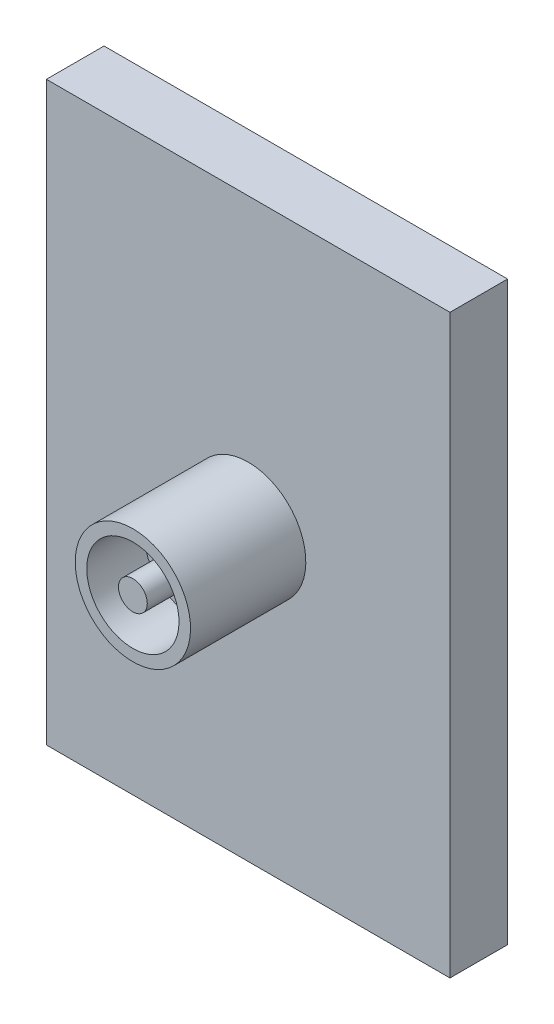
ISO-10303-21;
HEADER;
FILE_DESCRIPTION(('STEP AP214'),'2;1');
FILE_NAME('part.step','',(''),(''),'','','');
FILE_SCHEMA(('AUTOMOTIVE_DESIGN { 1 0 10303 214 1 1 1 1 }'));
ENDSEC;
DATA;
#1=APPLICATION_CONTEXT('core data for automotive mechanical design processes');
#2=APPLICATION_PROTOCOL_DEFINITION('international standard','automotive_design',2000,#1);
#3=PRODUCT_CONTEXT('',#1,'mechanical');
#4=PRODUCT('Part','Part','',(#3));
#5=PRODUCT_RELATED_PRODUCT_CATEGORY('part','',(#4));
#6=PRODUCT_DEFINITION_FORMATION('','',#4);
#7=PRODUCT_DEFINITION_CONTEXT('part definition',#1,'design');
#8=PRODUCT_DEFINITION('design','',#6,#7);
#9=PRODUCT_DEFINITION_SHAPE('','',#8);
#10=(LENGTH_UNIT() NAMED_UNIT(*) SI_UNIT(.MILLI.,.METRE.));
#11=(NAMED_UNIT(*) PLANE_ANGLE_UNIT() SI_UNIT($,.RADIAN.));
#12=(NAMED_UNIT(*) SI_UNIT($,.STERADIAN.) SOLID_ANGLE_UNIT());
#13=UNCERTAINTY_MEASURE_WITH_UNIT(LENGTH_MEASURE(1.E-05),#10,'distance_accuracy_value','');
#14=(GEOMETRIC_REPRESENTATION_CONTEXT(3) GLOBAL_UNCERTAINTY_ASSIGNED_CONTEXT((#13)) GLOBAL_UNIT_ASSIGNED_CONTEXT((#10,
#11,#12)) REPRESENTATION_CONTEXT('',''));
#15=CARTESIAN_POINT('',(0.,0.,0.));
#16=DIRECTION('',(0.,0.,1.));
#17=DIRECTION('',(1.,0.,0.));
#18=AXIS2_PLACEMENT_3D('',#15,#16,#17);
#19=CARTESIAN_POINT('',(0.,0.,5.));
#20=DIRECTION('',(0.,0.,-1.));
#21=DIRECTION('',(-1.,0.,0.));
#22=AXIS2_PLACEMENT_3D('',#19,#20,#21);
#23=PLANE('',#22);
#24=CARTESIAN_POINT('',(0.,0.,5.));
#25=DIRECTION('',(0.,0.,-1.));
#26=DIRECTION('',(0.,1.,0.));
#27=AXIS2_PLACEMENT_3D('',#24,#25,#26);
#28=CIRCLE('',#27,6.);
#29=CARTESIAN_POINT('',(0.,6.,5.));
#30=VERTEX_POINT('',#29);
#31=EDGE_CURVE('E161',#30,#30,#28,.T.);
#32=ORIENTED_EDGE('',*,*,#31,.F.);
#33=EDGE_LOOP('',(#32));
#34=FACE_BOUND('',#33,.T.);
#35=CARTESIAN_POINT('',(0.,0.,5.));
#36=DIRECTION('',(0.,0.,-1.));
#37=DIRECTION('',(-1.,0.,0.));
#38=AXIS2_PLACEMENT_3D('',#35,#36,#37);
#39=CIRCLE('',#38,2.5);
#40=CARTESIAN_POINT('',(-2.5,0.,5.));
#41=VERTEX_POINT('',#40);
#42=EDGE_CURVE('E11',#41,#41,#39,.F.);
#43=ORIENTED_EDGE('',*,*,#42,.F.);
#44=EDGE_LOOP('',(#43));
#45=FACE_BOUND('',#44,.T.);
#46=ADVANCED_FACE('F35',(#34,#45),#23,.F.);
#47=CARTESIAN_POINT('',(0.,0.,25.));
#48=DIRECTION('',(0.,0.,-1.));
#49=DIRECTION('',(-1.,0.,0.));
#50=AXIS2_PLACEMENT_3D('',#47,#48,#49);
#51=CYLINDRICAL_SURFACE('',#50,2.5);
#52=CARTESIAN_POINT('',(0.,0.,25.));
#53=DIRECTION('',(0.,0.,1.));
#54=DIRECTION('',(1.,0.,0.));
#55=AXIS2_PLACEMENT_3D('',#52,#53,#54);
#56=CIRCLE('',#55,2.5);
#57=CARTESIAN_POINT('',(2.5,0.,25.));
#58=VERTEX_POINT('',#57);
#59=EDGE_CURVE('E105',#58,#58,#56,.T.);
#60=ORIENTED_EDGE('',*,*,#59,.F.);
#61=EDGE_LOOP('',(#60));
#62=FACE_BOUND('',#61,.T.);
#63=ORIENTED_EDGE('',*,*,#42,.T.);
#64=EDGE_LOOP('',(#63));
#65=FACE_BOUND('',#64,.T.);
#66=ADVANCED_FACE('F128',(#62,#65),#51,.T.);
#67=CARTESIAN_POINT('',(0.,0.,25.));
#68=DIRECTION('',(0.,0.,1.));
#69=DIRECTION('',(1.,0.,0.));
#70=AXIS2_PLACEMENT_3D('',#67,#68,#69);
#71=PLANE('',#70);
#72=ORIENTED_EDGE('',*,*,#59,.T.);
#73=EDGE_LOOP('',(#72));
#74=FACE_BOUND('',#73,.T.);
#75=ADVANCED_FACE('F133',(#74),#71,.T.);
#76=CARTESIAN_POINT('',(0.,0.,0.));
#77=DIRECTION('',(0.,0.,-1.));
#78=DIRECTION('',(0.,1.,0.));
#79=AXIS2_PLACEMENT_3D('',#76,#77,#78);
#80=CYLINDRICAL_SURFACE('',#79,6.);
#81=ORIENTED_EDGE('',*,*,#31,.T.);
#82=EDGE_LOOP('',(#81));
#83=FACE_BOUND('',#82,.T.);
#84=CARTESIAN_POINT('',(0.,0.,15.));
#85=DIRECTION('',(0.,0.,-1.));
#86=DIRECTION('',(0.,1.,0.));
#87=AXIS2_PLACEMENT_3D('',#84,#85,#86);
#88=CIRCLE('',#87,6.);
#89=CARTESIAN_POINT('',(0.,6.,15.));
#90=VERTEX_POINT('',#89);
#91=EDGE_CURVE('E158',#90,#90,#88,.T.);
#92=ORIENTED_EDGE('',*,*,#91,.F.);
#93=EDGE_LOOP('',(#92));
#94=FACE_BOUND('',#93,.T.);
#95=ADVANCED_FACE('F170',(#83,#94),#80,.F.);
#96=CARTESIAN_POINT('',(0.,6.,15.));
#97=DIRECTION('',(0.,0.,1.));
#98=DIRECTION('',(0.,-1.,0.));
#99=AXIS2_PLACEMENT_3D('',#96,#97,#98);
#100=PLANE('',#99);
#101=ORIENTED_EDGE('',*,*,#91,.T.);
#102=EDGE_LOOP('',(#101));
#103=FACE_BOUND('',#102,.T.);
#104=CARTESIAN_POINT('',(0.,0.,15.));
#105=DIRECTION('',(0.,0.,-1.));
#106=DIRECTION('',(0.,1.,0.));
#107=AXIS2_PLACEMENT_3D('',#104,#105,#106);
#108=CIRCLE('',#107,8.);
#109=CARTESIAN_POINT('',(0.,8.,15.));
#110=VERTEX_POINT('',#109);
#111=EDGE_CURVE('E155',#110,#110,#108,.T.);
#112=ORIENTED_EDGE('',*,*,#111,.F.);
#113=EDGE_LOOP('',(#112));
#114=FACE_BOUND('',#113,.T.);
#115=ADVANCED_FACE('F175',(#103,#114),#100,.T.);
#116=CARTESIAN_POINT('',(0.,0.,0.));
#117=DIRECTION('',(0.,0.,-1.));
#118=DIRECTION('',(0.,1.,0.));
#119=AXIS2_PLACEMENT_3D('',#116,#117,#118);
#120=CYLINDRICAL_SURFACE('',#119,8.);
#121=ORIENTED_EDGE('',*,*,#111,.T.);
#122=EDGE_LOOP('',(#121));
#123=FACE_BOUND('',#122,.T.);
#124=CARTESIAN_POINT('',(0.,0.,25.));
#125=DIRECTION('',(0.,0.,-1.));
#126=DIRECTION('',(0.,1.,0.));
#127=AXIS2_PLACEMENT_3D('',#124,#125,#126);
#128=CIRCLE('',#127,8.00000000000001);
#129=CARTESIAN_POINT('',(0.,8.,25.));
#130=VERTEX_POINT('',#129);
#131=EDGE_CURVE('E150',#130,#130,#128,.T.);
#132=ORIENTED_EDGE('',*,*,#131,.F.);
#133=EDGE_LOOP('',(#132));
#134=FACE_BOUND('',#133,.T.);
#135=ADVANCED_FACE('F181',(#123,#134),#120,.F.);
#136=CARTESIAN_POINT('',(0.,8.,25.));
#137=DIRECTION('',(0.,0.,1.));
#138=DIRECTION('',(0.,-1.,0.));
#139=AXIS2_PLACEMENT_3D('',#136,#137,#138);
#140=PLANE('',#139);
#141=ORIENTED_EDGE('',*,*,#131,.T.);
#142=EDGE_LOOP('',(#141));
#143=FACE_BOUND('',#142,.T.);
#144=CARTESIAN_POINT('',(0.,0.,25.));
#145=DIRECTION('',(0.,0.,-1.));
#146=DIRECTION('',(0.,1.,0.));
#147=AXIS2_PLACEMENT_3D('',#144,#145,#146);
#148=CIRCLE('',#147,10.);
#149=CARTESIAN_POINT('',(0.,10.,25.));
#150=VERTEX_POINT('',#149);
#151=EDGE_CURVE('E147',#150,#150,#148,.T.);
#152=ORIENTED_EDGE('',*,*,#151,.F.);
#153=EDGE_LOOP('',(#152));
#154=FACE_BOUND('',#153,.T.);
#155=ADVANCED_FACE('F123',(#143,#154),#140,.T.);
#156=CARTESIAN_POINT('',(0.,0.,0.));
#157=DIRECTION('',(0.,0.,-1.));
#158=DIRECTION('',(0.,1.,0.));
#159=AXIS2_PLACEMENT_3D('',#156,#157,#158);
#160=CYLINDRICAL_SURFACE('',#159,10.);
#161=ORIENTED_EDGE('',*,*,#151,.T.);
#162=EDGE_LOOP('',(#161));
#163=FACE_BOUND('',#162,.T.);
#164=CARTESIAN_POINT('',(0.,0.,5.));
#165=DIRECTION('',(0.,0.,-1.));
#166=DIRECTION('',(0.,1.,0.));
#167=AXIS2_PLACEMENT_3D('',#164,#165,#166);
#168=CIRCLE('',#167,10.);
#169=CARTESIAN_POINT('',(0.,10.,5.));
#170=VERTEX_POINT('',#169);
#171=EDGE_CURVE('E145',#170,#170,#168,.T.);
#172=ORIENTED_EDGE('',*,*,#171,.F.);
#173=EDGE_LOOP('',(#172));
#174=FACE_BOUND('',#173,.T.);
#175=ADVANCED_FACE('F116',(#163,#174),#160,.T.);
#176=CARTESIAN_POINT('',(0.,0.,-5.));
#177=DIRECTION('',(0.,0.,-1.));
#178=DIRECTION('',(-1.,0.,0.));
#179=AXIS2_PLACEMENT_3D('',#176,#177,#178);
#180=PLANE('',#179);
#181=DIRECTION('',(0.,1.,0.));
#182=VECTOR('',#181,1.);
#183=CARTESIAN_POINT('',(35.,-50.,-5.));
#184=LINE('',#183,#182);
#185=CARTESIAN_POINT('',(35.,-50.,-5.));
#186=VERTEX_POINT('',#185);
#187=CARTESIAN_POINT('',(35.,50.,-5.));
#188=VERTEX_POINT('',#187);
#189=EDGE_CURVE('E102',#186,#188,#184,.T.);
#190=ORIENTED_EDGE('',*,*,#189,.F.);
#191=DIRECTION('',(1.,0.,0.));
#192=VECTOR('',#191,1.);
#193=CARTESIAN_POINT('',(-35.,-50.,-5.));
#194=LINE('',#193,#192);
#195=CARTESIAN_POINT('',(-35.,-50.,-5.));
#196=VERTEX_POINT('',#195);
#197=EDGE_CURVE('E75',#196,#186,#194,.T.);
#198=ORIENTED_EDGE('',*,*,#197,.F.);
#199=DIRECTION('',(0.,-1.,0.));
#200=VECTOR('',#199,1.);
#201=CARTESIAN_POINT('',(-35.,-50.,-5.));
#202=LINE('',#201,#200);
#203=CARTESIAN_POINT('',(-35.,50.,-5.));
#204=VERTEX_POINT('',#203);
#205=EDGE_CURVE('E69',#204,#196,#202,.T.);
#206=ORIENTED_EDGE('',*,*,#205,.F.);
#207=DIRECTION('',(-1.,0.,0.));
#208=VECTOR('',#207,1.);
#209=CARTESIAN_POINT('',(-35.,50.,-5.));
#210=LINE('',#209,#208);
#211=EDGE_CURVE('E93',#188,#204,#210,.T.);
#212=ORIENTED_EDGE('',*,*,#211,.F.);
#213=EDGE_LOOP('',(#190,#198,#206,#212));
#214=FACE_BOUND('',#213,.T.);
#215=ADVANCED_FACE('F113',(#214),#180,.T.);
#216=CARTESIAN_POINT('',(-35.,-50.,5.));
#217=DIRECTION('',(0.,1.,0.));
#218=DIRECTION('',(0.,0.,1.));
#219=AXIS2_PLACEMENT_3D('',#216,#217,#218);
#220=PLANE('',#219);
#221=ORIENTED_EDGE('',*,*,#197,.T.);
#222=DIRECTION('',(0.,0.,-1.));
#223=VECTOR('',#222,1.);
#224=CARTESIAN_POINT('',(35.,-50.,5.));
#225=LINE('',#224,#223);
#226=CARTESIAN_POINT('',(35.,-50.,5.));
#227=VERTEX_POINT('',#226);
#228=EDGE_CURVE('E98',#227,#186,#225,.T.);
#229=ORIENTED_EDGE('',*,*,#228,.F.);
#230=DIRECTION('',(1.,0.,0.));
#231=VECTOR('',#230,1.);
#232=CARTESIAN_POINT('',(-35.,-50.,5.));
#233=LINE('',#232,#231);
#234=CARTESIAN_POINT('',(-35.,-50.,5.));
#235=VERTEX_POINT('',#234);
#236=EDGE_CURVE('E52',#235,#227,#233,.T.);
#237=ORIENTED_EDGE('',*,*,#236,.F.);
#238=DIRECTION('',(0.,0.,-1.));
#239=VECTOR('',#238,1.);
#240=CARTESIAN_POINT('',(-35.,-50.,5.));
#241=LINE('',#240,#239);
#242=EDGE_CURVE('E94',#235,#196,#241,.T.);
#243=ORIENTED_EDGE('',*,*,#242,.T.);
#244=EDGE_LOOP('',(#221,#229,#237,#243));
#245=FACE_BOUND('',#244,.T.);
#246=ADVANCED_FACE('F115',(#245),#220,.F.);
#247=CARTESIAN_POINT('',(-35.,-50.,5.));
#248=DIRECTION('',(1.,0.,0.));
#249=DIRECTION('',(0.,0.,-1.));
#250=AXIS2_PLACEMENT_3D('',#247,#248,#249);
#251=PLANE('',#250);
#252=ORIENTED_EDGE('',*,*,#205,.T.);
#253=ORIENTED_EDGE('',*,*,#242,.F.);
#254=DIRECTION('',(0.,-1.,0.));
#255=VECTOR('',#254,1.);
#256=CARTESIAN_POINT('',(-35.,-50.,5.));
#257=LINE('',#256,#255);
#258=CARTESIAN_POINT('',(-35.,50.,5.));
#259=VERTEX_POINT('',#258);
#260=EDGE_CURVE('E86',#259,#235,#257,.T.);
#261=ORIENTED_EDGE('',*,*,#260,.F.);
#262=DIRECTION('',(0.,0.,-1.));
#263=VECTOR('',#262,1.);
#264=CARTESIAN_POINT('',(-35.,50.,5.));
#265=LINE('',#264,#263);
#266=EDGE_CURVE('E91',#259,#204,#265,.T.);
#267=ORIENTED_EDGE('',*,*,#266,.T.);
#268=EDGE_LOOP('',(#252,#253,#261,#267));
#269=FACE_BOUND('',#268,.T.);
#270=ADVANCED_FACE('F96',(#269),#251,.F.);
#271=CARTESIAN_POINT('',(-35.,50.,5.));
#272=DIRECTION('',(0.,-1.,0.));
#273=DIRECTION('',(0.,0.,-1.));
#274=AXIS2_PLACEMENT_3D('',#271,#272,#273);
#275=PLANE('',#274);
#276=ORIENTED_EDGE('',*,*,#211,.T.);
#277=ORIENTED_EDGE('',*,*,#266,.F.);
#278=DIRECTION('',(-1.,0.,0.));
#279=VECTOR('',#278,1.);
#280=CARTESIAN_POINT('',(-35.,50.,5.));
#281=LINE('',#280,#279);
#282=CARTESIAN_POINT('',(35.,50.,5.));
#283=VERTEX_POINT('',#282);
#284=EDGE_CURVE('E83',#283,#259,#281,.T.);
#285=ORIENTED_EDGE('',*,*,#284,.F.);
#286=DIRECTION('',(0.,0.,-1.));
#287=VECTOR('',#286,1.);
#288=CARTESIAN_POINT('',(35.,50.,5.));
#289=LINE('',#288,#287);
#290=EDGE_CURVE('E44',#283,#188,#289,.T.);
#291=ORIENTED_EDGE('',*,*,#290,.T.);
#292=EDGE_LOOP('',(#276,#277,#285,#291));
#293=FACE_BOUND('',#292,.T.);
#294=ADVANCED_FACE('F92',(#293),#275,.F.);
#295=CARTESIAN_POINT('',(35.,-50.,5.));
#296=DIRECTION('',(-1.,0.,0.));
#297=DIRECTION('',(0.,0.,1.));
#298=AXIS2_PLACEMENT_3D('',#295,#296,#297);
#299=PLANE('',#298);
#300=ORIENTED_EDGE('',*,*,#189,.T.);
#301=ORIENTED_EDGE('',*,*,#290,.F.);
#302=DIRECTION('',(0.,1.,0.));
#303=VECTOR('',#302,1.);
#304=CARTESIAN_POINT('',(35.,-50.,5.));
#305=LINE('',#304,#303);
#306=EDGE_CURVE('E88',#227,#283,#305,.T.);
#307=ORIENTED_EDGE('',*,*,#306,.F.);
#308=ORIENTED_EDGE('',*,*,#228,.T.);
#309=EDGE_LOOP('',(#300,#301,#307,#308));
#310=FACE_BOUND('',#309,.T.);
#311=ADVANCED_FACE('F37',(#310),#299,.F.);
#312=ORIENTED_EDGE('',*,*,#171,.T.);
#313=EDGE_LOOP('',(#312));
#314=FACE_BOUND('',#313,.T.);
#315=ORIENTED_EDGE('',*,*,#306,.T.);
#316=ORIENTED_EDGE('',*,*,#284,.T.);
#317=ORIENTED_EDGE('',*,*,#260,.T.);
#318=ORIENTED_EDGE('',*,*,#236,.T.);
#319=EDGE_LOOP('',(#315,#316,#317,#318));
#320=FACE_BOUND('',#319,.T.);
#321=ADVANCED_FACE('F84',(#314,#320),#23,.F.);
#322=CLOSED_SHELL('',(#46,#66,#75,#95,#115,#135,#155,#175,#215,#246,#270,#294,#311,#321));
#323=MANIFOLD_SOLID_BREP('B2',#322);
#324=ADVANCED_BREP_SHAPE_REPRESENTATION('',(#18,#323),#14);
#325=SHAPE_DEFINITION_REPRESENTATION(#9,#324);
ENDSEC;
END-ISO-10303-21;
